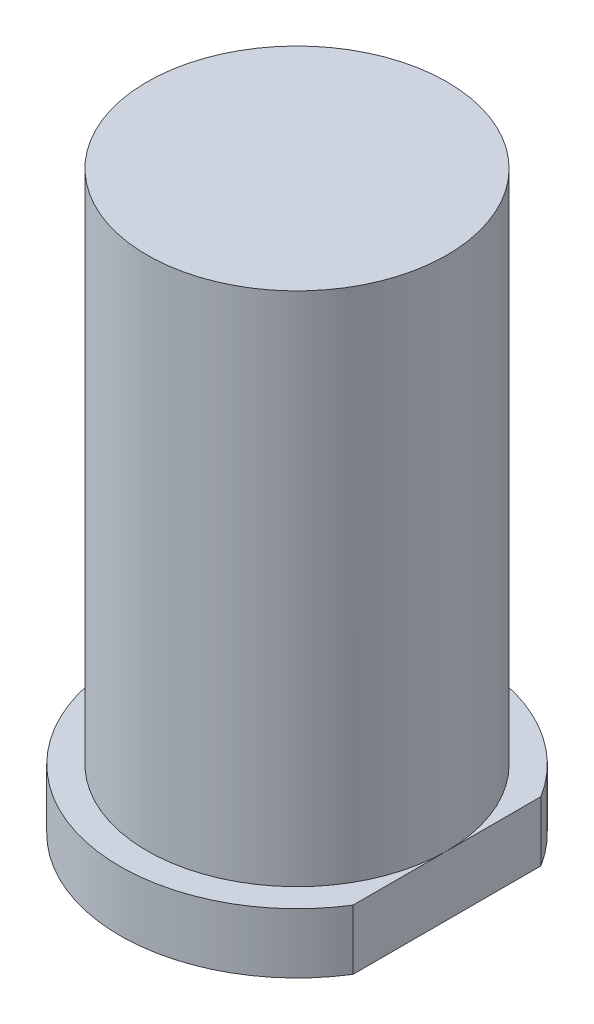
ISO-10303-21;
HEADER;
FILE_DESCRIPTION(('STEP AP214'),'2;1');
FILE_NAME('part.step','',(''),(''),'','','');
FILE_SCHEMA(('AUTOMOTIVE_DESIGN { 1 0 10303 214 1 1 1 1 }'));
ENDSEC;
DATA;
#1=APPLICATION_CONTEXT('core data for automotive mechanical design processes');
#2=APPLICATION_PROTOCOL_DEFINITION('international standard','automotive_design',2000,#1);
#3=PRODUCT_CONTEXT('',#1,'mechanical');
#4=PRODUCT('Part','Part','',(#3));
#5=PRODUCT_RELATED_PRODUCT_CATEGORY('part','',(#4));
#6=PRODUCT_DEFINITION_FORMATION('','',#4);
#7=PRODUCT_DEFINITION_CONTEXT('part definition',#1,'design');
#8=PRODUCT_DEFINITION('design','',#6,#7);
#9=PRODUCT_DEFINITION_SHAPE('','',#8);
#10=(LENGTH_UNIT() NAMED_UNIT(*) SI_UNIT(.MILLI.,.METRE.));
#11=(NAMED_UNIT(*) PLANE_ANGLE_UNIT() SI_UNIT($,.RADIAN.));
#12=(NAMED_UNIT(*) SI_UNIT($,.STERADIAN.) SOLID_ANGLE_UNIT());
#13=UNCERTAINTY_MEASURE_WITH_UNIT(LENGTH_MEASURE(1.E-05),#10,'distance_accuracy_value','');
#14=(GEOMETRIC_REPRESENTATION_CONTEXT(3) GLOBAL_UNCERTAINTY_ASSIGNED_CONTEXT((#13)) GLOBAL_UNIT_ASSIGNED_CONTEXT((#10,
#11,#12)) REPRESENTATION_CONTEXT('',''));
#15=CARTESIAN_POINT('',(0.,0.,0.));
#16=DIRECTION('',(0.,0.,1.));
#17=DIRECTION('',(1.,0.,0.));
#18=AXIS2_PLACEMENT_3D('',#15,#16,#17);
#19=CARTESIAN_POINT('',(15.181676102923,-9.,-0.436607342392));
#20=DIRECTION('',(-1.,0.,0.));
#21=DIRECTION('',(0.,0.,1.));
#22=AXIS2_PLACEMENT_3D('',#19,#20,#21);
#23=PLANE('',#22);
#24=DIRECTION('',(0.,0.,1.));
#25=VECTOR('',#24,1.);
#26=CARTESIAN_POINT('',(15.181676102923,1.,7.749913174009));
#27=LINE('',#26,#25);
#28=CARTESIAN_POINT('',(15.181676102923,1.,9.31595915034529));
#29=VERTEX_POINT('',#28);
#30=CARTESIAN_POINT('',(15.181676102923,1.,6.18386719767221));
#31=VERTEX_POINT('',#30);
#32=EDGE_CURVE('E20',#29,#31,#27,.F.);
#33=ORIENTED_EDGE('',*,*,#32,.F.);
#34=DIRECTION('',(0.,1.,0.));
#35=VECTOR('',#34,1.);
#36=CARTESIAN_POINT('',(15.181676102923,-9.,9.315959150345));
#37=LINE('',#36,#35);
#38=CARTESIAN_POINT('',(15.181676102923,0.,9.31595915034529));
#39=VERTEX_POINT('',#38);
#40=EDGE_CURVE('E35',#39,#29,#37,.T.);
#41=ORIENTED_EDGE('',*,*,#40,.F.);
#42=DIRECTION('',(0.,0.,1.));
#43=VECTOR('',#42,1.);
#44=CARTESIAN_POINT('',(15.181676102923,0.,7.749913174009));
#45=LINE('',#44,#43);
#46=CARTESIAN_POINT('',(15.181676102923,0.,6.18386719767221));
#47=VERTEX_POINT('',#46);
#48=EDGE_CURVE('E49',#39,#47,#45,.F.);
#49=ORIENTED_EDGE('',*,*,#48,.T.);
#50=DIRECTION('',(0.,1.,0.));
#51=VECTOR('',#50,1.);
#52=CARTESIAN_POINT('',(15.181676102923,-9.,6.183867197672));
#53=LINE('',#52,#51);
#54=EDGE_CURVE('E47',#31,#47,#53,.F.);
#55=ORIENTED_EDGE('',*,*,#54,.F.);
#56=EDGE_LOOP('',(#33,#41,#49,#55));
#57=FACE_BOUND('',#56,.T.);
#58=ADVANCED_FACE('F17',(#57),#23,.F.);
#59=CARTESIAN_POINT('',(12.681676102923,0.,7.749913174009));
#60=DIRECTION('',(0.,1.,0.));
#61=DIRECTION('',(0.,0.,1.));
#62=AXIS2_PLACEMENT_3D('',#59,#60,#61);
#63=PLANE('',#62);
#64=ORIENTED_EDGE('',*,*,#48,.F.);
#65=CARTESIAN_POINT('',(12.681676102923,0.,7.749913174009));
#66=DIRECTION('',(0.,-1.,0.));
#67=DIRECTION('',(0.,0.,-1.));
#68=AXIS2_PLACEMENT_3D('',#65,#66,#67);
#69=CIRCLE('',#68,2.95);
#70=EDGE_CURVE('E52',#47,#39,#69,.F.);
#71=ORIENTED_EDGE('',*,*,#70,.F.);
#72=EDGE_LOOP('',(#64,#71));
#73=FACE_BOUND('',#72,.T.);
#74=ADVANCED_FACE('F61',(#73),#63,.F.);
#75=CARTESIAN_POINT('',(12.681676102923,1.,7.749913174009));
#76=DIRECTION('',(0.,-1.,0.));
#77=DIRECTION('',(0.,0.,-1.));
#78=AXIS2_PLACEMENT_3D('',#75,#76,#77);
#79=CYLINDRICAL_SURFACE('',#78,2.95);
#80=ORIENTED_EDGE('',*,*,#70,.T.);
#81=ORIENTED_EDGE('',*,*,#40,.T.);
#82=CARTESIAN_POINT('',(12.681676102923,1.,7.749913174009));
#83=DIRECTION('',(0.,-1.,0.));
#84=DIRECTION('',(0.,0.,-1.));
#85=AXIS2_PLACEMENT_3D('',#82,#83,#84);
#86=CIRCLE('',#85,2.95);
#87=EDGE_CURVE('E44',#31,#29,#86,.F.);
#88=ORIENTED_EDGE('',*,*,#87,.F.);
#89=ORIENTED_EDGE('',*,*,#54,.T.);
#90=EDGE_LOOP('',(#80,#81,#88,#89));
#91=FACE_BOUND('',#90,.T.);
#92=ADVANCED_FACE('F51',(#91),#79,.T.);
#93=CARTESIAN_POINT('',(12.681676102923,9.6,7.749913174009));
#94=DIRECTION('',(0.,1.,0.));
#95=DIRECTION('',(0.,0.,1.));
#96=AXIS2_PLACEMENT_3D('',#93,#94,#95);
#97=PLANE('',#96);
#98=CARTESIAN_POINT('',(12.681676102923,9.6,7.749913174009));
#99=DIRECTION('',(0.,-1.,0.));
#100=DIRECTION('',(0.,0.,-1.));
#101=AXIS2_PLACEMENT_3D('',#98,#99,#100);
#102=CIRCLE('',#101,2.5);
#103=CARTESIAN_POINT('',(12.681676102923,9.6,5.249913174009));
#104=VERTEX_POINT('',#103);
#105=EDGE_CURVE('E26',#104,#104,#102,.T.);
#106=ORIENTED_EDGE('',*,*,#105,.F.);
#107=EDGE_LOOP('',(#106));
#108=FACE_BOUND('',#107,.T.);
#109=ADVANCED_FACE('F68',(#108),#97,.T.);
#110=CARTESIAN_POINT('',(12.681676102923,1.,7.749913174009));
#111=DIRECTION('',(0.,1.,0.));
#112=DIRECTION('',(0.,0.,1.));
#113=AXIS2_PLACEMENT_3D('',#110,#111,#112);
#114=PLANE('',#113);
#115=CARTESIAN_POINT('',(12.681676102923,0.999999999999999,7.749913174009));
#116=DIRECTION('',(0.,-1.,0.));
#117=DIRECTION('',(0.,0.,-1.));
#118=AXIS2_PLACEMENT_3D('',#115,#116,#117);
#119=CIRCLE('',#118,2.5);
#120=CARTESIAN_POINT('',(12.681676102923,0.999999999999999,5.249913174009));
#121=VERTEX_POINT('',#120);
#122=EDGE_CURVE('E11',#121,#121,#119,.F.);
#123=ORIENTED_EDGE('',*,*,#122,.F.);
#124=EDGE_LOOP('',(#123));
#125=FACE_BOUND('',#124,.T.);
#126=ORIENTED_EDGE('',*,*,#87,.T.);
#127=ORIENTED_EDGE('',*,*,#32,.T.);
#128=EDGE_LOOP('',(#126,#127));
#129=FACE_BOUND('',#128,.T.);
#130=ADVANCED_FACE('F54',(#125,#129),#114,.T.);
#131=CARTESIAN_POINT('',(12.681676102923,9.6,7.749913174009));
#132=DIRECTION('',(0.,-1.,0.));
#133=DIRECTION('',(0.,0.,-1.));
#134=AXIS2_PLACEMENT_3D('',#131,#132,#133);
#135=CYLINDRICAL_SURFACE('',#134,2.5);
#136=ORIENTED_EDGE('',*,*,#122,.T.);
#137=EDGE_LOOP('',(#136));
#138=FACE_BOUND('',#137,.T.);
#139=ORIENTED_EDGE('',*,*,#105,.T.);
#140=EDGE_LOOP('',(#139));
#141=FACE_BOUND('',#140,.T.);
#142=ADVANCED_FACE('F70',(#138,#141),#135,.T.);
#143=CLOSED_SHELL('',(#58,#74,#92,#109,#130,#142));
#144=MANIFOLD_SOLID_BREP('B1',#143);
#145=ADVANCED_BREP_SHAPE_REPRESENTATION('',(#18,#144),#14);
#146=SHAPE_DEFINITION_REPRESENTATION(#9,#145);
ENDSEC;
END-ISO-10303-21;
